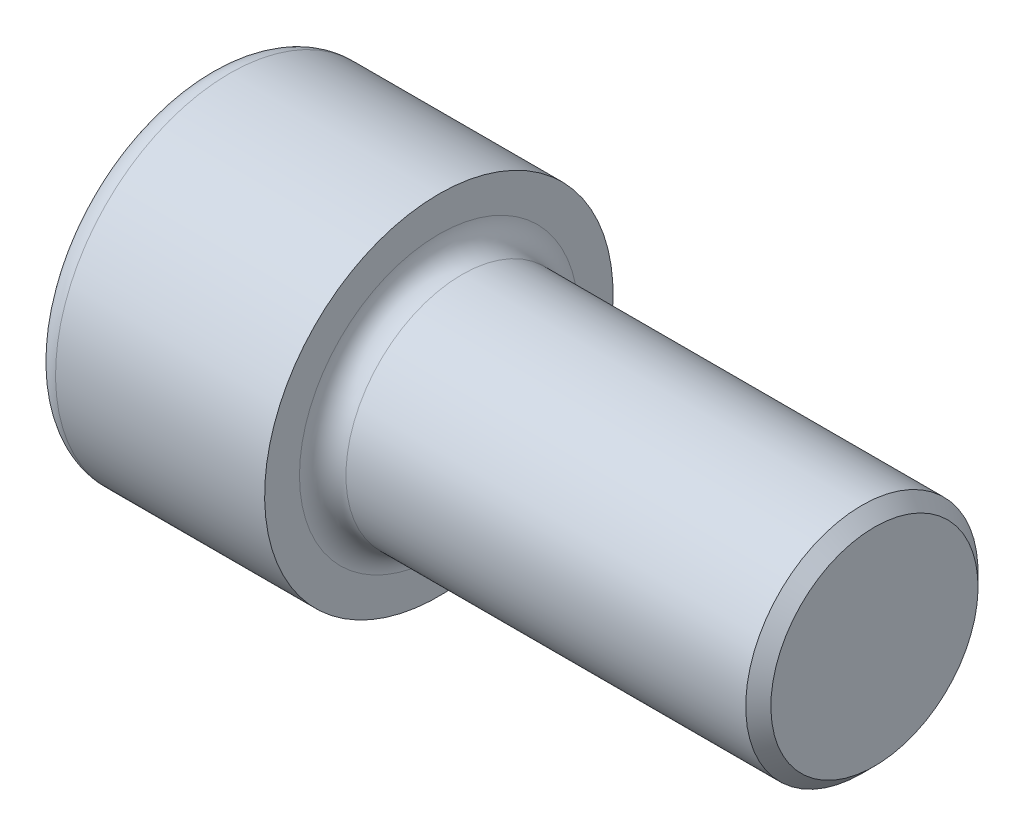
ISO-10303-21;
HEADER;
FILE_DESCRIPTION(('STEP AP214'),'2;1');
FILE_NAME('part.step','',(''),(''),'','','');
FILE_SCHEMA(('AUTOMOTIVE_DESIGN { 1 0 10303 214 1 1 1 1 }'));
ENDSEC;
DATA;
#1=APPLICATION_CONTEXT('core data for automotive mechanical design processes');
#2=APPLICATION_PROTOCOL_DEFINITION('international standard','automotive_design',2000,#1);
#3=PRODUCT_CONTEXT('',#1,'mechanical');
#4=PRODUCT('Part','Part','',(#3));
#5=PRODUCT_RELATED_PRODUCT_CATEGORY('part','',(#4));
#6=PRODUCT_DEFINITION_FORMATION('','',#4);
#7=PRODUCT_DEFINITION_CONTEXT('part definition',#1,'design');
#8=PRODUCT_DEFINITION('design','',#6,#7);
#9=PRODUCT_DEFINITION_SHAPE('','',#8);
#10=(LENGTH_UNIT() NAMED_UNIT(*) SI_UNIT(.MILLI.,.METRE.));
#11=(NAMED_UNIT(*) PLANE_ANGLE_UNIT() SI_UNIT($,.RADIAN.));
#12=(NAMED_UNIT(*) SI_UNIT($,.STERADIAN.) SOLID_ANGLE_UNIT());
#13=UNCERTAINTY_MEASURE_WITH_UNIT(LENGTH_MEASURE(1.E-05),#10,'distance_accuracy_value','');
#14=(GEOMETRIC_REPRESENTATION_CONTEXT(3) GLOBAL_UNCERTAINTY_ASSIGNED_CONTEXT((#13)) GLOBAL_UNIT_ASSIGNED_CONTEXT((#10,
#11,#12)) REPRESENTATION_CONTEXT('',''));
#15=CARTESIAN_POINT('',(0.,0.,0.));
#16=DIRECTION('',(0.,0.,1.));
#17=DIRECTION('',(1.,0.,0.));
#18=AXIS2_PLACEMENT_3D('',#15,#16,#17);
#19=CARTESIAN_POINT('',(-16.001,-3.5009076947986,-6.06375));
#20=DIRECTION('',(0.,-0.5,-0.866025403784439));
#21=DIRECTION('',(0.,0.866025403784439,-0.5));
#22=AXIS2_PLACEMENT_3D('',#19,#20,#21);
#23=PLANE('',#22);
#24=DIRECTION('',(0.,0.866025403784439,-0.5));
#25=VECTOR('',#24,1.);
#26=CARTESIAN_POINT('',(-16.,-1.55090769479859,-7.18958302491977));
#27=LINE('',#26,#25);
#28=CARTESIAN_POINT('',(-16.,-7.00181538959719,-4.0425));
#29=VERTEX_POINT('',#28);
#30=CARTESIAN_POINT('',(-16.,0.,-8.085));
#31=VERTEX_POINT('',#30);
#32=EDGE_CURVE('E33',#29,#31,#27,.T.);
#33=ORIENTED_EDGE('',*,*,#32,.F.);
#34=DIRECTION('',(-1.,0.,0.));
#35=VECTOR('',#34,1.);
#36=CARTESIAN_POINT('',(-12.001,-7.00181538959719,-4.0425));
#37=LINE('',#36,#35);
#38=CARTESIAN_POINT('',(-8.001,-7.00181538959719,-4.0425));
#39=VERTEX_POINT('',#38);
#40=EDGE_CURVE('E109',#39,#29,#37,.T.);
#41=ORIENTED_EDGE('',*,*,#40,.F.);
#42=CARTESIAN_POINT('',(-8.001,0.,-8.085));
#43=CARTESIAN_POINT('',(-6.83403076840047,-3.50090769479859,-6.06375000000001));
#44=CARTESIAN_POINT('',(-8.001,-7.00181538959719,-4.0425));
#45=(BOUNDED_CURVE() B_SPLINE_CURVE(2,(#42,#43,#44),.UNSPECIFIED.,.F.,
.F.) B_SPLINE_CURVE_WITH_KNOTS((3,3),(0.,8.18117413335548),
.UNSPECIFIED.) CURVE() GEOMETRIC_REPRESENTATION_ITEM() RATIONAL_B_SPLINE_CURVE((1.,
1.15470053837925,1.)) REPRESENTATION_ITEM(''));
#46=CARTESIAN_POINT('',(-8.001,0.,-8.085));
#47=VERTEX_POINT('',#46);
#48=EDGE_CURVE('E124',#47,#39,#45,.T.);
#49=ORIENTED_EDGE('',*,*,#48,.F.);
#50=DIRECTION('',(-1.,0.,0.));
#51=VECTOR('',#50,1.);
#52=CARTESIAN_POINT('',(-12.001,0.,-8.085));
#53=LINE('',#52,#51);
#54=EDGE_CURVE('E10',#47,#31,#53,.T.);
#55=ORIENTED_EDGE('',*,*,#54,.T.);
#56=EDGE_LOOP('',(#33,#41,#49,#55));
#57=FACE_BOUND('',#56,.T.);
#58=ADVANCED_FACE('F15',(#57),#23,.F.);
#59=CARTESIAN_POINT('',(-16.001,3.5009076947986,-6.06375));
#60=DIRECTION('',(0.,0.5,-0.866025403784439));
#61=DIRECTION('',(0.,0.866025403784439,0.5));
#62=AXIS2_PLACEMENT_3D('',#59,#60,#61);
#63=PLANE('',#62);
#64=DIRECTION('',(0.,0.866025403784439,0.5));
#65=VECTOR('',#64,1.);
#66=CARTESIAN_POINT('',(-16.,5.45090769479859,-4.93791697508023));
#67=LINE('',#66,#65);
#68=CARTESIAN_POINT('',(-16.,7.00181538959719,-4.0425));
#69=VERTEX_POINT('',#68);
#70=EDGE_CURVE('E191',#31,#69,#67,.T.);
#71=ORIENTED_EDGE('',*,*,#70,.F.);
#72=ORIENTED_EDGE('',*,*,#54,.F.);
#73=CARTESIAN_POINT('',(-8.001,7.00181538959718,-4.0425));
#74=CARTESIAN_POINT('',(-6.83403076840047,3.50090769479859,-6.06375000000001));
#75=CARTESIAN_POINT('',(-8.001,0.,-8.085));
#76=(BOUNDED_CURVE() B_SPLINE_CURVE(2,(#73,#74,#75),.UNSPECIFIED.,.F.,
.F.) B_SPLINE_CURVE_WITH_KNOTS((3,3),(0.,8.18117413335547),
.UNSPECIFIED.) CURVE() GEOMETRIC_REPRESENTATION_ITEM() RATIONAL_B_SPLINE_CURVE((1.,
1.15470053837925,1.)) REPRESENTATION_ITEM(''));
#77=CARTESIAN_POINT('',(-8.001,7.00181538959719,-4.0425));
#78=VERTEX_POINT('',#77);
#79=EDGE_CURVE('E131',#78,#47,#76,.T.);
#80=ORIENTED_EDGE('',*,*,#79,.F.);
#81=DIRECTION('',(-1.,0.,0.));
#82=VECTOR('',#81,1.);
#83=CARTESIAN_POINT('',(-12.001,7.00181538959719,-4.0425));
#84=LINE('',#83,#82);
#85=EDGE_CURVE('E25',#78,#69,#84,.T.);
#86=ORIENTED_EDGE('',*,*,#85,.T.);
#87=EDGE_LOOP('',(#71,#72,#80,#86));
#88=FACE_BOUND('',#87,.T.);
#89=ADVANCED_FACE('F203',(#88),#63,.F.);
#90=CARTESIAN_POINT('',(-16.001,7.00181538959719,0.));
#91=DIRECTION('',(0.,1.,0.));
#92=DIRECTION('',(0.,0.,1.));
#93=AXIS2_PLACEMENT_3D('',#90,#91,#92);
#94=PLANE('',#93);
#95=DIRECTION('',(0.,0.,1.));
#96=VECTOR('',#95,1.);
#97=CARTESIAN_POINT('',(-16.,7.00181538959719,0.));
#98=LINE('',#97,#96);
#99=CARTESIAN_POINT('',(-16.,7.00181538959719,4.0425));
#100=VERTEX_POINT('',#99);
#101=EDGE_CURVE('E122',#69,#100,#98,.T.);
#102=ORIENTED_EDGE('',*,*,#101,.F.);
#103=ORIENTED_EDGE('',*,*,#85,.F.);
#104=CARTESIAN_POINT('',(-8.001,7.00181538959719,4.0425));
#105=CARTESIAN_POINT('',(-6.83403076840047,7.00181538959718,0.));
#106=CARTESIAN_POINT('',(-8.001,7.00181538959719,-4.0425));
#107=(BOUNDED_CURVE() B_SPLINE_CURVE(2,(#104,#105,#106),.UNSPECIFIED.,.F.,
.F.) B_SPLINE_CURVE_WITH_KNOTS((3,3),(0.,8.18117413335548),
.UNSPECIFIED.) CURVE() GEOMETRIC_REPRESENTATION_ITEM() RATIONAL_B_SPLINE_CURVE((1.,
1.15470053837925,1.)) REPRESENTATION_ITEM(''));
#108=CARTESIAN_POINT('',(-8.001,7.00181538959719,4.0425));
#109=VERTEX_POINT('',#108);
#110=EDGE_CURVE('E101',#109,#78,#107,.T.);
#111=ORIENTED_EDGE('',*,*,#110,.F.);
#112=DIRECTION('',(-1.,0.,0.));
#113=VECTOR('',#112,1.);
#114=CARTESIAN_POINT('',(-12.001,7.00181538959719,4.0425));
#115=LINE('',#114,#113);
#116=EDGE_CURVE('E96',#109,#100,#115,.T.);
#117=ORIENTED_EDGE('',*,*,#116,.T.);
#118=EDGE_LOOP('',(#102,#103,#111,#117));
#119=FACE_BOUND('',#118,.T.);
#120=ADVANCED_FACE('F188',(#119),#94,.F.);
#121=CARTESIAN_POINT('',(-16.001,-7.00181538959719,0.));
#122=DIRECTION('',(0.,-1.,0.));
#123=DIRECTION('',(0.,0.,-1.));
#124=AXIS2_PLACEMENT_3D('',#121,#122,#123);
#125=PLANE('',#124);
#126=DIRECTION('',(0.,0.,-1.));
#127=VECTOR('',#126,1.);
#128=CARTESIAN_POINT('',(-16.,-7.00181538959719,0.));
#129=LINE('',#128,#127);
#130=CARTESIAN_POINT('',(-16.,-7.00181538959719,4.0425));
#131=VERTEX_POINT('',#130);
#132=EDGE_CURVE('E168',#131,#29,#129,.T.);
#133=ORIENTED_EDGE('',*,*,#132,.F.);
#134=DIRECTION('',(-1.,0.,0.));
#135=VECTOR('',#134,1.);
#136=CARTESIAN_POINT('',(-12.001,-7.00181538959719,4.0425));
#137=LINE('',#136,#135);
#138=CARTESIAN_POINT('',(-8.001,-7.00181538959719,4.0425));
#139=VERTEX_POINT('',#138);
#140=EDGE_CURVE('E110',#139,#131,#137,.T.);
#141=ORIENTED_EDGE('',*,*,#140,.F.);
#142=CARTESIAN_POINT('',(-8.001,-7.00181538959719,-4.0425));
#143=CARTESIAN_POINT('',(-6.83403076840047,-7.00181538959718,0.));
#144=CARTESIAN_POINT('',(-8.001,-7.00181538959719,4.0425));
#145=(BOUNDED_CURVE() B_SPLINE_CURVE(2,(#142,#143,#144),.UNSPECIFIED.,.F.,
.F.) B_SPLINE_CURVE_WITH_KNOTS((3,3),(0.,8.18117413335549),
.UNSPECIFIED.) CURVE() GEOMETRIC_REPRESENTATION_ITEM() RATIONAL_B_SPLINE_CURVE((1.,
1.15470053837925,1.)) REPRESENTATION_ITEM(''));
#146=EDGE_CURVE('E114',#39,#139,#145,.T.);
#147=ORIENTED_EDGE('',*,*,#146,.F.);
#148=ORIENTED_EDGE('',*,*,#40,.T.);
#149=EDGE_LOOP('',(#133,#141,#147,#148));
#150=FACE_BOUND('',#149,.T.);
#151=ADVANCED_FACE('F201',(#150),#125,.F.);
#152=CARTESIAN_POINT('',(-16.001,3.5009076947986,6.06375));
#153=DIRECTION('',(0.,0.5,0.866025403784439));
#154=DIRECTION('',(0.,-0.866025403784439,0.5));
#155=AXIS2_PLACEMENT_3D('',#152,#153,#154);
#156=PLANE('',#155);
#157=DIRECTION('',(0.,-0.866025403784439,0.5));
#158=VECTOR('',#157,1.);
#159=CARTESIAN_POINT('',(-16.,5.4509076947986,4.93791697508023));
#160=LINE('',#159,#158);
#161=CARTESIAN_POINT('',(-16.,0.,8.085));
#162=VERTEX_POINT('',#161);
#163=EDGE_CURVE('E167',#100,#162,#160,.T.);
#164=ORIENTED_EDGE('',*,*,#163,.F.);
#165=ORIENTED_EDGE('',*,*,#116,.F.);
#166=CARTESIAN_POINT('',(-8.001,0.,8.085));
#167=CARTESIAN_POINT('',(-6.83403076840046,3.50090769479859,6.06375));
#168=CARTESIAN_POINT('',(-8.001,7.00181538959719,4.0425));
#169=(BOUNDED_CURVE() B_SPLINE_CURVE(2,(#166,#167,#168),.UNSPECIFIED.,.F.,
.F.) B_SPLINE_CURVE_WITH_KNOTS((3,3),(0.,8.18117413335548),
.UNSPECIFIED.) CURVE() GEOMETRIC_REPRESENTATION_ITEM() RATIONAL_B_SPLINE_CURVE((1.,
1.15470053837925,1.)) REPRESENTATION_ITEM(''));
#170=CARTESIAN_POINT('',(-8.001,0.,8.085));
#171=VERTEX_POINT('',#170);
#172=EDGE_CURVE('E90',#171,#109,#169,.T.);
#173=ORIENTED_EDGE('',*,*,#172,.F.);
#174=DIRECTION('',(1.,0.,0.));
#175=VECTOR('',#174,1.);
#176=CARTESIAN_POINT('',(-12.001,0.,8.085));
#177=LINE('',#176,#175);
#178=EDGE_CURVE('E19',#162,#171,#177,.T.);
#179=ORIENTED_EDGE('',*,*,#178,.F.);
#180=EDGE_LOOP('',(#164,#165,#173,#179));
#181=FACE_BOUND('',#180,.T.);
#182=ADVANCED_FACE('F93',(#181),#156,.F.);
#183=CARTESIAN_POINT('',(-16.001,-3.5009076947986,6.06375));
#184=DIRECTION('',(0.,-0.5,0.866025403784439));
#185=DIRECTION('',(0.,-0.866025403784439,-0.5));
#186=AXIS2_PLACEMENT_3D('',#183,#184,#185);
#187=PLANE('',#186);
#188=DIRECTION('',(0.,-0.866025403784439,-0.5));
#189=VECTOR('',#188,1.);
#190=CARTESIAN_POINT('',(-16.,-1.55090769479859,7.18958302491977));
#191=LINE('',#190,#189);
#192=EDGE_CURVE('E108',#162,#131,#191,.T.);
#193=ORIENTED_EDGE('',*,*,#192,.F.);
#194=ORIENTED_EDGE('',*,*,#178,.T.);
#195=CARTESIAN_POINT('',(-8.001,-7.00181538959719,4.0425));
#196=CARTESIAN_POINT('',(-6.83403076840046,-3.50090769479859,6.06375));
#197=CARTESIAN_POINT('',(-8.001,0.,8.085));
#198=(BOUNDED_CURVE() B_SPLINE_CURVE(2,(#195,#196,#197),.UNSPECIFIED.,.F.,
.F.) B_SPLINE_CURVE_WITH_KNOTS((3,3),(0.,8.18117413335548),
.UNSPECIFIED.) CURVE() GEOMETRIC_REPRESENTATION_ITEM() RATIONAL_B_SPLINE_CURVE((1.,
1.15470053837925,1.)) REPRESENTATION_ITEM(''));
#199=EDGE_CURVE('E100',#139,#171,#198,.T.);
#200=ORIENTED_EDGE('',*,*,#199,.F.);
#201=ORIENTED_EDGE('',*,*,#140,.T.);
#202=EDGE_LOOP('',(#193,#194,#200,#201));
#203=FACE_BOUND('',#202,.T.);
#204=ADVANCED_FACE('F105',(#203),#187,.F.);
#205=CARTESIAN_POINT('',(-5.66706153680094,0.,0.));
#206=DIRECTION('',(-1.,0.,0.));
#207=DIRECTION('',(0.,1.,0.));
#208=AXIS2_PLACEMENT_3D('',#205,#206,#207);
#209=CONICAL_SURFACE('',#208,4.0425,1.0471975511966);
#210=ORIENTED_EDGE('',*,*,#146,.T.);
#211=ORIENTED_EDGE('',*,*,#199,.T.);
#212=ORIENTED_EDGE('',*,*,#172,.T.);
#213=ORIENTED_EDGE('',*,*,#110,.T.);
#214=ORIENTED_EDGE('',*,*,#79,.T.);
#215=ORIENTED_EDGE('',*,*,#48,.T.);
#216=EDGE_LOOP('',(#210,#211,#212,#213,#214,#215));
#217=FACE_BOUND('',#216,.T.);
#218=CARTESIAN_POINT('',(-3.33312307360187,0.,0.));
#219=VERTEX_POINT('',#218);
#220=VERTEX_LOOP('',#219);
#221=FACE_BOUND('',#220,.T.);
#222=ADVANCED_FACE('F111',(#217,#221),#209,.F.);
#223=CARTESIAN_POINT('',(1.6,0.,0.));
#224=DIRECTION('',(1.,0.,0.));
#225=DIRECTION('',(0.,0.,-1.));
#226=AXIS2_PLACEMENT_3D('',#223,#224,#225);
#227=TOROIDAL_SURFACE('',#226,9.6,1.6);
#228=CARTESIAN_POINT('',(1.6,0.,0.));
#229=DIRECTION('',(1.,0.,0.));
#230=DIRECTION('',(0.,1.,0.));
#231=AXIS2_PLACEMENT_3D('',#228,#229,#230);
#232=CIRCLE('',#231,8.);
#233=CARTESIAN_POINT('',(1.6,8.,0.));
#234=VERTEX_POINT('',#233);
#235=EDGE_CURVE('E140',#234,#234,#232,.T.);
#236=ORIENTED_EDGE('',*,*,#235,.F.);
#237=EDGE_LOOP('',(#236));
#238=FACE_BOUND('',#237,.T.);
#239=CARTESIAN_POINT('',(0.,0.,0.));
#240=DIRECTION('',(1.,0.,0.));
#241=DIRECTION('',(0.,1.,0.));
#242=AXIS2_PLACEMENT_3D('',#239,#240,#241);
#243=CIRCLE('',#242,9.6);
#244=CARTESIAN_POINT('',(0.,9.6,0.));
#245=VERTEX_POINT('',#244);
#246=EDGE_CURVE('E132',#245,#245,#243,.T.);
#247=ORIENTED_EDGE('',*,*,#246,.T.);
#248=EDGE_LOOP('',(#247));
#249=FACE_BOUND('',#248,.T.);
#250=ADVANCED_FACE('F223',(#238,#249),#227,.F.);
#251=CARTESIAN_POINT('',(15.367,0.,0.));
#252=DIRECTION('',(-1.,0.,0.));
#253=DIRECTION('',(0.,1.,0.));
#254=AXIS2_PLACEMENT_3D('',#251,#252,#253);
#255=CYLINDRICAL_SURFACE('',#254,8.);
#256=CARTESIAN_POINT('',(29.134,0.,0.));
#257=DIRECTION('',(1.,0.,0.));
#258=DIRECTION('',(0.,1.,0.));
#259=AXIS2_PLACEMENT_3D('',#256,#257,#258);
#260=CIRCLE('',#259,8.);
#261=CARTESIAN_POINT('',(29.134,8.,0.));
#262=VERTEX_POINT('',#261);
#263=EDGE_CURVE('E143',#262,#262,#260,.T.);
#264=ORIENTED_EDGE('',*,*,#263,.F.);
#265=EDGE_LOOP('',(#264));
#266=FACE_BOUND('',#265,.T.);
#267=ORIENTED_EDGE('',*,*,#235,.T.);
#268=EDGE_LOOP('',(#267));
#269=FACE_BOUND('',#268,.T.);
#270=ADVANCED_FACE('F219',(#266,#269),#255,.T.);
#271=CARTESIAN_POINT('',(29.567,0.,0.));
#272=DIRECTION('',(-1.,0.,0.));
#273=DIRECTION('',(0.,1.,0.));
#274=AXIS2_PLACEMENT_3D('',#271,#272,#273);
#275=CONICAL_SURFACE('',#274,7.567,0.785398163397448);
#276=CARTESIAN_POINT('',(30.,0.,0.));
#277=DIRECTION('',(1.,0.,0.));
#278=DIRECTION('',(0.,1.,0.));
#279=AXIS2_PLACEMENT_3D('',#276,#277,#278);
#280=CIRCLE('',#279,7.134);
#281=CARTESIAN_POINT('',(30.,7.134,0.));
#282=VERTEX_POINT('',#281);
#283=EDGE_CURVE('E155',#282,#282,#280,.T.);
#284=ORIENTED_EDGE('',*,*,#283,.F.);
#285=EDGE_LOOP('',(#284));
#286=FACE_BOUND('',#285,.T.);
#287=ORIENTED_EDGE('',*,*,#263,.T.);
#288=EDGE_LOOP('',(#287));
#289=FACE_BOUND('',#288,.T.);
#290=ADVANCED_FACE('F215',(#286,#289),#275,.T.);
#291=CARTESIAN_POINT('',(30.,3.567,0.));
#292=DIRECTION('',(1.,0.,0.));
#293=DIRECTION('',(0.,1.,0.));
#294=AXIS2_PLACEMENT_3D('',#291,#292,#293);
#295=PLANE('',#294);
#296=ORIENTED_EDGE('',*,*,#283,.T.);
#297=EDGE_LOOP('',(#296));
#298=FACE_BOUND('',#297,.T.);
#299=ADVANCED_FACE('F218',(#298),#295,.T.);
#300=CARTESIAN_POINT('',(-16.,5.2,0.));
#301=DIRECTION('',(-1.,0.,0.));
#302=DIRECTION('',(0.,-1.,0.));
#303=AXIS2_PLACEMENT_3D('',#300,#301,#302);
#304=PLANE('',#303);
#305=ORIENTED_EDGE('',*,*,#163,.T.);
#306=ORIENTED_EDGE('',*,*,#192,.T.);
#307=ORIENTED_EDGE('',*,*,#132,.T.);
#308=ORIENTED_EDGE('',*,*,#32,.T.);
#309=ORIENTED_EDGE('',*,*,#70,.T.);
#310=ORIENTED_EDGE('',*,*,#101,.T.);
#311=EDGE_LOOP('',(#305,#306,#307,#308,#309,#310));
#312=FACE_BOUND('',#311,.T.);
#313=CARTESIAN_POINT('',(-16.,0.,0.));
#314=DIRECTION('',(1.,0.,0.));
#315=DIRECTION('',(0.,1.,0.));
#316=AXIS2_PLACEMENT_3D('',#313,#314,#315);
#317=CIRCLE('',#316,10.4);
#318=CARTESIAN_POINT('',(-16.,10.4,0.));
#319=VERTEX_POINT('',#318);
#320=EDGE_CURVE('E133',#319,#319,#317,.T.);
#321=ORIENTED_EDGE('',*,*,#320,.F.);
#322=EDGE_LOOP('',(#321));
#323=FACE_BOUND('',#322,.T.);
#324=ADVANCED_FACE('F198',(#312,#323),#304,.T.);
#325=CARTESIAN_POINT('',(-14.4,0.,0.));
#326=DIRECTION('',(1.,0.,0.));
#327=DIRECTION('',(0.,0.,-1.));
#328=AXIS2_PLACEMENT_3D('',#325,#326,#327);
#329=TOROIDAL_SURFACE('',#328,10.4,1.6);
#330=CARTESIAN_POINT('',(-14.4,0.,0.));
#331=DIRECTION('',(1.,0.,0.));
#332=DIRECTION('',(0.,1.,0.));
#333=AXIS2_PLACEMENT_3D('',#330,#331,#332);
#334=CIRCLE('',#333,12.);
#335=CARTESIAN_POINT('',(-14.4,12.,0.));
#336=VERTEX_POINT('',#335);
#337=EDGE_CURVE('E139',#336,#336,#334,.T.);
#338=ORIENTED_EDGE('',*,*,#337,.F.);
#339=EDGE_LOOP('',(#338));
#340=FACE_BOUND('',#339,.T.);
#341=ORIENTED_EDGE('',*,*,#320,.T.);
#342=EDGE_LOOP('',(#341));
#343=FACE_BOUND('',#342,.T.);
#344=ADVANCED_FACE('F17',(#340,#343),#329,.T.);
#345=CARTESIAN_POINT('',(-7.2,0.,0.));
#346=DIRECTION('',(-1.,0.,0.));
#347=DIRECTION('',(0.,1.,0.));
#348=AXIS2_PLACEMENT_3D('',#345,#346,#347);
#349=CYLINDRICAL_SURFACE('',#348,12.);
#350=CARTESIAN_POINT('',(0.,0.,0.));
#351=DIRECTION('',(1.,0.,0.));
#352=DIRECTION('',(0.,1.,0.));
#353=AXIS2_PLACEMENT_3D('',#350,#351,#352);
#354=CIRCLE('',#353,12.);
#355=CARTESIAN_POINT('',(0.,12.,0.));
#356=VERTEX_POINT('',#355);
#357=EDGE_CURVE('E176',#356,#356,#354,.T.);
#358=ORIENTED_EDGE('',*,*,#357,.F.);
#359=EDGE_LOOP('',(#358));
#360=FACE_BOUND('',#359,.T.);
#361=ORIENTED_EDGE('',*,*,#337,.T.);
#362=EDGE_LOOP('',(#361));
#363=FACE_BOUND('',#362,.T.);
#364=ADVANCED_FACE('F234',(#360,#363),#349,.T.);
#365=CARTESIAN_POINT('',(0.,10.8,0.));
#366=DIRECTION('',(1.,0.,0.));
#367=DIRECTION('',(0.,1.,0.));
#368=AXIS2_PLACEMENT_3D('',#365,#366,#367);
#369=PLANE('',#368);
#370=ORIENTED_EDGE('',*,*,#246,.F.);
#371=EDGE_LOOP('',(#370));
#372=FACE_BOUND('',#371,.T.);
#373=ORIENTED_EDGE('',*,*,#357,.T.);
#374=EDGE_LOOP('',(#373));
#375=FACE_BOUND('',#374,.T.);
#376=ADVANCED_FACE('F232',(#372,#375),#369,.T.);
#377=CLOSED_SHELL('',(#58,#89,#120,#151,#182,#204,#222,#250,#270,#290,#299,#324,#344,#364,#376));
#378=MANIFOLD_SOLID_BREP('B1',#377);
#379=ADVANCED_BREP_SHAPE_REPRESENTATION('',(#18,#378),#14);
#380=SHAPE_DEFINITION_REPRESENTATION(#9,#379);
ENDSEC;
END-ISO-10303-21;
